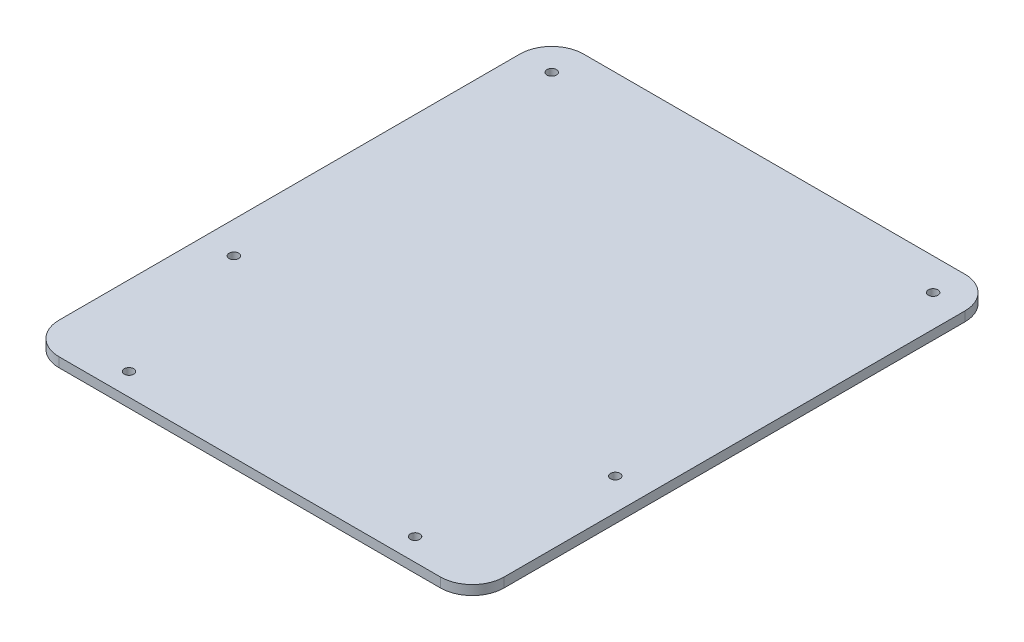
ISO-10303-21;
HEADER;
FILE_DESCRIPTION(('STEP AP214'),'2;1');
FILE_NAME('part.step','',(''),(''),'','','');
FILE_SCHEMA(('AUTOMOTIVE_DESIGN { 1 0 10303 214 1 1 1 1 }'));
ENDSEC;
DATA;
#1=APPLICATION_CONTEXT('core data for automotive mechanical design processes');
#2=APPLICATION_PROTOCOL_DEFINITION('international standard','automotive_design',2000,#1);
#3=PRODUCT_CONTEXT('',#1,'mechanical');
#4=PRODUCT('Part','Part','',(#3));
#5=PRODUCT_RELATED_PRODUCT_CATEGORY('part','',(#4));
#6=PRODUCT_DEFINITION_FORMATION('','',#4);
#7=PRODUCT_DEFINITION_CONTEXT('part definition',#1,'design');
#8=PRODUCT_DEFINITION('design','',#6,#7);
#9=PRODUCT_DEFINITION_SHAPE('','',#8);
#10=(LENGTH_UNIT() NAMED_UNIT(*) SI_UNIT(.MILLI.,.METRE.));
#11=(NAMED_UNIT(*) PLANE_ANGLE_UNIT() SI_UNIT($,.RADIAN.));
#12=(NAMED_UNIT(*) SI_UNIT($,.STERADIAN.) SOLID_ANGLE_UNIT());
#13=UNCERTAINTY_MEASURE_WITH_UNIT(LENGTH_MEASURE(1.E-05),#10,'distance_accuracy_value','');
#14=(GEOMETRIC_REPRESENTATION_CONTEXT(3) GLOBAL_UNCERTAINTY_ASSIGNED_CONTEXT((#13)) GLOBAL_UNIT_ASSIGNED_CONTEXT((#10,
#11,#12)) REPRESENTATION_CONTEXT('',''));
#15=CARTESIAN_POINT('',(0.,0.,0.));
#16=DIRECTION('',(0.,0.,1.));
#17=DIRECTION('',(1.,0.,0.));
#18=AXIS2_PLACEMENT_3D('',#15,#16,#17);
#19=CARTESIAN_POINT('',(70.,3.,0.));
#20=DIRECTION('',(1.,0.,0.));
#21=DIRECTION('',(0.,0.,-1.));
#22=AXIS2_PLACEMENT_3D('',#19,#20,#21);
#23=PLANE('',#22);
#24=DIRECTION('',(0.,0.,1.));
#25=VECTOR('',#24,1.);
#26=CARTESIAN_POINT('',(70.,0.,0.));
#27=LINE('',#26,#25);
#28=CARTESIAN_POINT('',(70.,0.,-50.));
#29=VERTEX_POINT('',#28);
#30=CARTESIAN_POINT('',(70.,0.,95.));
#31=VERTEX_POINT('',#30);
#32=EDGE_CURVE('E111',#29,#31,#27,.T.);
#33=ORIENTED_EDGE('',*,*,#32,.F.);
#34=DIRECTION('',(0.,1.,0.));
#35=VECTOR('',#34,1.);
#36=CARTESIAN_POINT('',(70.,3.,-50.));
#37=LINE('',#36,#35);
#38=CARTESIAN_POINT('',(70.,3.,-50.));
#39=VERTEX_POINT('',#38);
#40=EDGE_CURVE('E172',#29,#39,#37,.T.);
#41=ORIENTED_EDGE('',*,*,#40,.T.);
#42=DIRECTION('',(0.,0.,1.));
#43=VECTOR('',#42,1.);
#44=CARTESIAN_POINT('',(70.,3.,0.));
#45=LINE('',#44,#43);
#46=CARTESIAN_POINT('',(70.,3.,95.));
#47=VERTEX_POINT('',#46);
#48=EDGE_CURVE('E138',#39,#47,#45,.T.);
#49=ORIENTED_EDGE('',*,*,#48,.T.);
#50=DIRECTION('',(0.,-1.,0.));
#51=VECTOR('',#50,1.);
#52=CARTESIAN_POINT('',(70.,0.,95.));
#53=LINE('',#52,#51);
#54=EDGE_CURVE('E131',#47,#31,#53,.T.);
#55=ORIENTED_EDGE('',*,*,#54,.T.);
#56=EDGE_LOOP('',(#33,#41,#49,#55));
#57=FACE_BOUND('',#56,.T.);
#58=ADVANCED_FACE('F45',(#57),#23,.T.);
#59=CARTESIAN_POINT('',(-69.9999999999999,3.,0.));
#60=DIRECTION('',(1.,0.,0.));
#61=DIRECTION('',(0.,0.,-1.));
#62=AXIS2_PLACEMENT_3D('',#59,#60,#61);
#63=PLANE('',#62);
#64=DIRECTION('',(0.,0.,1.));
#65=VECTOR('',#64,1.);
#66=CARTESIAN_POINT('',(-69.9999999999999,3.,0.));
#67=LINE('',#66,#65);
#68=CARTESIAN_POINT('',(-70.,3.,-50.));
#69=VERTEX_POINT('',#68);
#70=CARTESIAN_POINT('',(-69.9999999999998,3.,95.));
#71=VERTEX_POINT('',#70);
#72=EDGE_CURVE('E148',#69,#71,#67,.T.);
#73=ORIENTED_EDGE('',*,*,#72,.F.);
#74=DIRECTION('',(0.,1.,0.));
#75=VECTOR('',#74,1.);
#76=CARTESIAN_POINT('',(-70.,3.,-50.));
#77=LINE('',#76,#75);
#78=CARTESIAN_POINT('',(-70.,0.,-50.));
#79=VERTEX_POINT('',#78);
#80=EDGE_CURVE('E11',#69,#79,#77,.F.);
#81=ORIENTED_EDGE('',*,*,#80,.T.);
#82=DIRECTION('',(0.,0.,1.));
#83=VECTOR('',#82,1.);
#84=CARTESIAN_POINT('',(-69.9999999999999,0.,0.));
#85=LINE('',#84,#83);
#86=CARTESIAN_POINT('',(-69.9999999999998,0.,95.));
#87=VERTEX_POINT('',#86);
#88=EDGE_CURVE('E123',#79,#87,#85,.T.);
#89=ORIENTED_EDGE('',*,*,#88,.T.);
#90=DIRECTION('',(0.,-1.,0.));
#91=VECTOR('',#90,1.);
#92=CARTESIAN_POINT('',(-69.9999999999998,3.,95.));
#93=LINE('',#92,#91);
#94=EDGE_CURVE('E165',#87,#71,#93,.F.);
#95=ORIENTED_EDGE('',*,*,#94,.T.);
#96=EDGE_LOOP('',(#73,#81,#89,#95));
#97=FACE_BOUND('',#96,.T.);
#98=ADVANCED_FACE('F199',(#97),#63,.F.);
#99=CARTESIAN_POINT('',(0.,3.,105.));
#100=DIRECTION('',(0.,0.,-1.));
#101=DIRECTION('',(-1.,0.,0.));
#102=AXIS2_PLACEMENT_3D('',#99,#100,#101);
#103=PLANE('',#102);
#104=DIRECTION('',(1.,0.,0.));
#105=VECTOR('',#104,1.);
#106=CARTESIAN_POINT('',(0.,0.,105.));
#107=LINE('',#106,#105);
#108=CARTESIAN_POINT('',(-59.9999999999998,0.,105.));
#109=VERTEX_POINT('',#108);
#110=CARTESIAN_POINT('',(60.,0.,105.));
#111=VERTEX_POINT('',#110);
#112=EDGE_CURVE('E151',#109,#111,#107,.T.);
#113=ORIENTED_EDGE('',*,*,#112,.T.);
#114=DIRECTION('',(0.,-1.,0.));
#115=VECTOR('',#114,1.);
#116=CARTESIAN_POINT('',(60.,3.,105.));
#117=LINE('',#116,#115);
#118=CARTESIAN_POINT('',(60.,3.,105.));
#119=VERTEX_POINT('',#118);
#120=EDGE_CURVE('E132',#111,#119,#117,.F.);
#121=ORIENTED_EDGE('',*,*,#120,.T.);
#122=DIRECTION('',(1.,0.,0.));
#123=VECTOR('',#122,1.);
#124=CARTESIAN_POINT('',(0.,3.,105.));
#125=LINE('',#124,#123);
#126=CARTESIAN_POINT('',(-59.9999999999998,3.,105.));
#127=VERTEX_POINT('',#126);
#128=EDGE_CURVE('E141',#127,#119,#125,.T.);
#129=ORIENTED_EDGE('',*,*,#128,.F.);
#130=DIRECTION('',(0.,-1.,0.));
#131=VECTOR('',#130,1.);
#132=CARTESIAN_POINT('',(-59.9999999999998,3.,105.));
#133=LINE('',#132,#131);
#134=EDGE_CURVE('E134',#127,#109,#133,.T.);
#135=ORIENTED_EDGE('',*,*,#134,.T.);
#136=EDGE_LOOP('',(#113,#121,#129,#135));
#137=FACE_BOUND('',#136,.T.);
#138=ADVANCED_FACE('F210',(#137),#103,.F.);
#139=CARTESIAN_POINT('',(0.,3.,0.));
#140=DIRECTION('',(0.,1.,0.));
#141=DIRECTION('',(0.,0.,1.));
#142=AXIS2_PLACEMENT_3D('',#139,#140,#141);
#143=PLANE('',#142);
#144=ORIENTED_EDGE('',*,*,#48,.F.);
#145=CARTESIAN_POINT('',(60.,3.,-50.));
#146=DIRECTION('',(0.,1.,0.));
#147=DIRECTION('',(0.,0.,1.));
#148=AXIS2_PLACEMENT_3D('',#145,#146,#147);
#149=CIRCLE('',#148,10.);
#150=CARTESIAN_POINT('',(60.,3.,-60.));
#151=VERTEX_POINT('',#150);
#152=EDGE_CURVE('E178',#39,#151,#149,.T.);
#153=ORIENTED_EDGE('',*,*,#152,.T.);
#154=DIRECTION('',(1.,0.,0.));
#155=VECTOR('',#154,1.);
#156=CARTESIAN_POINT('',(-70.,3.,-60.));
#157=LINE('',#156,#155);
#158=CARTESIAN_POINT('',(-60.,3.,-60.));
#159=VERTEX_POINT('',#158);
#160=EDGE_CURVE('E198',#159,#151,#157,.T.);
#161=ORIENTED_EDGE('',*,*,#160,.F.);
#162=CARTESIAN_POINT('',(-60.,3.,-50.));
#163=DIRECTION('',(0.,1.,0.));
#164=DIRECTION('',(0.,0.,1.));
#165=AXIS2_PLACEMENT_3D('',#162,#163,#164);
#166=CIRCLE('',#165,10.);
#167=EDGE_CURVE('E175',#159,#69,#166,.T.);
#168=ORIENTED_EDGE('',*,*,#167,.T.);
#169=ORIENTED_EDGE('',*,*,#72,.T.);
#170=CARTESIAN_POINT('',(-59.9999999999998,3.,95.));
#171=DIRECTION('',(0.,1.,0.));
#172=DIRECTION('',(0.,0.,1.));
#173=AXIS2_PLACEMENT_3D('',#170,#171,#172);
#174=CIRCLE('',#173,10.);
#175=EDGE_CURVE('E159',#71,#127,#174,.T.);
#176=ORIENTED_EDGE('',*,*,#175,.T.);
#177=ORIENTED_EDGE('',*,*,#128,.T.);
#178=CARTESIAN_POINT('',(60.,3.,95.));
#179=DIRECTION('',(0.,1.,0.));
#180=DIRECTION('',(0.,0.,1.));
#181=AXIS2_PLACEMENT_3D('',#178,#179,#180);
#182=CIRCLE('',#181,10.);
#183=EDGE_CURVE('E162',#119,#47,#182,.T.);
#184=ORIENTED_EDGE('',*,*,#183,.T.);
#185=EDGE_LOOP('',(#144,#153,#161,#168,#169,#176,#177,#184));
#186=FACE_BOUND('',#185,.T.);
#187=CARTESIAN_POINT('',(45.,3.,98.));
#188=DIRECTION('',(0.,1.,0.));
#189=DIRECTION('',(0.,0.,1.));
#190=AXIS2_PLACEMENT_3D('',#187,#188,#189);
#191=CIRCLE('',#190,1.5);
#192=CARTESIAN_POINT('',(45.,3.,99.5));
#193=VERTEX_POINT('',#192);
#194=EDGE_CURVE('E439',#193,#193,#191,.T.);
#195=ORIENTED_EDGE('',*,*,#194,.F.);
#196=EDGE_LOOP('',(#195));
#197=FACE_BOUND('',#196,.T.);
#198=CARTESIAN_POINT('',(60.,3.,-50.));
#199=DIRECTION('',(0.,1.,0.));
#200=DIRECTION('',(0.,0.,-1.));
#201=AXIS2_PLACEMENT_3D('',#198,#199,#200);
#202=CIRCLE('',#201,1.5);
#203=CARTESIAN_POINT('',(60.,3.,-51.5));
#204=VERTEX_POINT('',#203);
#205=EDGE_CURVE('E433',#204,#204,#202,.T.);
#206=ORIENTED_EDGE('',*,*,#205,.F.);
#207=EDGE_LOOP('',(#206));
#208=FACE_BOUND('',#207,.T.);
#209=CARTESIAN_POINT('',(-60.,3.,-50.));
#210=DIRECTION('',(0.,1.,0.));
#211=DIRECTION('',(0.,0.,1.));
#212=AXIS2_PLACEMENT_3D('',#209,#210,#211);
#213=CIRCLE('',#212,1.5);
#214=CARTESIAN_POINT('',(-60.,3.,-48.5));
#215=VERTEX_POINT('',#214);
#216=EDGE_CURVE('E124',#215,#215,#213,.T.);
#217=ORIENTED_EDGE('',*,*,#216,.F.);
#218=EDGE_LOOP('',(#217));
#219=FACE_BOUND('',#218,.T.);
#220=CARTESIAN_POINT('',(-45.,3.,98.));
#221=DIRECTION('',(0.,1.,0.));
#222=DIRECTION('',(0.,0.,-1.));
#223=AXIS2_PLACEMENT_3D('',#220,#221,#222);
#224=CIRCLE('',#223,1.5);
#225=CARTESIAN_POINT('',(-45.,3.,96.5));
#226=VERTEX_POINT('',#225);
#227=EDGE_CURVE('E445',#226,#226,#224,.T.);
#228=ORIENTED_EDGE('',*,*,#227,.F.);
#229=EDGE_LOOP('',(#228));
#230=FACE_BOUND('',#229,.T.);
#231=CARTESIAN_POINT('',(60.,3.,50.));
#232=DIRECTION('',(0.,1.,0.));
#233=DIRECTION('',(0.,0.,1.));
#234=AXIS2_PLACEMENT_3D('',#231,#232,#233);
#235=CIRCLE('',#234,1.5);
#236=CARTESIAN_POINT('',(60.,3.,51.5));
#237=VERTEX_POINT('',#236);
#238=EDGE_CURVE('E454',#237,#237,#235,.T.);
#239=ORIENTED_EDGE('',*,*,#238,.F.);
#240=EDGE_LOOP('',(#239));
#241=FACE_BOUND('',#240,.T.);
#242=CARTESIAN_POINT('',(-60.,3.,50.));
#243=DIRECTION('',(0.,1.,0.));
#244=DIRECTION('',(0.,0.,-1.));
#245=AXIS2_PLACEMENT_3D('',#242,#243,#244);
#246=CIRCLE('',#245,1.5);
#247=CARTESIAN_POINT('',(-60.,3.,48.5));
#248=VERTEX_POINT('',#247);
#249=EDGE_CURVE('E426',#248,#248,#246,.T.);
#250=ORIENTED_EDGE('',*,*,#249,.F.);
#251=EDGE_LOOP('',(#250));
#252=FACE_BOUND('',#251,.T.);
#253=ADVANCED_FACE('F196',(#186,#197,#208,#219,#230,#241,#252),#143,.T.);
#254=CARTESIAN_POINT('',(0.,0.,0.));
#255=DIRECTION('',(0.,1.,0.));
#256=DIRECTION('',(0.,0.,1.));
#257=AXIS2_PLACEMENT_3D('',#254,#255,#256);
#258=PLANE('',#257);
#259=CARTESIAN_POINT('',(45.,0.,98.));
#260=DIRECTION('',(0.,1.,0.));
#261=DIRECTION('',(0.,0.,1.));
#262=AXIS2_PLACEMENT_3D('',#259,#260,#261);
#263=CIRCLE('',#262,1.5);
#264=CARTESIAN_POINT('',(45.,0.,99.5));
#265=VERTEX_POINT('',#264);
#266=EDGE_CURVE('E406',#265,#265,#263,.T.);
#267=ORIENTED_EDGE('',*,*,#266,.T.);
#268=EDGE_LOOP('',(#267));
#269=FACE_BOUND('',#268,.T.);
#270=CARTESIAN_POINT('',(60.,0.,-50.));
#271=DIRECTION('',(0.,1.,0.));
#272=DIRECTION('',(0.,0.,-1.));
#273=AXIS2_PLACEMENT_3D('',#270,#271,#272);
#274=CIRCLE('',#273,1.5);
#275=CARTESIAN_POINT('',(60.,0.,-51.5));
#276=VERTEX_POINT('',#275);
#277=EDGE_CURVE('E410',#276,#276,#274,.T.);
#278=ORIENTED_EDGE('',*,*,#277,.T.);
#279=EDGE_LOOP('',(#278));
#280=FACE_BOUND('',#279,.T.);
#281=CARTESIAN_POINT('',(-60.,0.,-50.));
#282=DIRECTION('',(0.,1.,0.));
#283=DIRECTION('',(0.,0.,1.));
#284=AXIS2_PLACEMENT_3D('',#281,#282,#283);
#285=CIRCLE('',#284,1.5);
#286=CARTESIAN_POINT('',(-60.,0.,-48.5));
#287=VERTEX_POINT('',#286);
#288=EDGE_CURVE('E414',#287,#287,#285,.T.);
#289=ORIENTED_EDGE('',*,*,#288,.T.);
#290=EDGE_LOOP('',(#289));
#291=FACE_BOUND('',#290,.T.);
#292=CARTESIAN_POINT('',(-45.,0.,98.));
#293=DIRECTION('',(0.,1.,0.));
#294=DIRECTION('',(0.,0.,-1.));
#295=AXIS2_PLACEMENT_3D('',#292,#293,#294);
#296=CIRCLE('',#295,1.5);
#297=CARTESIAN_POINT('',(-45.,0.,96.5));
#298=VERTEX_POINT('',#297);
#299=EDGE_CURVE('E418',#298,#298,#296,.T.);
#300=ORIENTED_EDGE('',*,*,#299,.T.);
#301=EDGE_LOOP('',(#300));
#302=FACE_BOUND('',#301,.T.);
#303=CARTESIAN_POINT('',(60.,0.,50.));
#304=DIRECTION('',(0.,1.,0.));
#305=DIRECTION('',(0.,0.,1.));
#306=AXIS2_PLACEMENT_3D('',#303,#304,#305);
#307=CIRCLE('',#306,1.5);
#308=CARTESIAN_POINT('',(60.,0.,51.5));
#309=VERTEX_POINT('',#308);
#310=EDGE_CURVE('E422',#309,#309,#307,.T.);
#311=ORIENTED_EDGE('',*,*,#310,.T.);
#312=EDGE_LOOP('',(#311));
#313=FACE_BOUND('',#312,.T.);
#314=CARTESIAN_POINT('',(-60.,0.,50.));
#315=DIRECTION('',(0.,1.,0.));
#316=DIRECTION('',(0.,0.,-1.));
#317=AXIS2_PLACEMENT_3D('',#314,#315,#316);
#318=CIRCLE('',#317,1.5);
#319=CARTESIAN_POINT('',(-60.,0.,48.5));
#320=VERTEX_POINT('',#319);
#321=EDGE_CURVE('E217',#320,#320,#318,.T.);
#322=ORIENTED_EDGE('',*,*,#321,.T.);
#323=EDGE_LOOP('',(#322));
#324=FACE_BOUND('',#323,.T.);
#325=DIRECTION('',(1.,0.,0.));
#326=VECTOR('',#325,1.);
#327=CARTESIAN_POINT('',(0.,0.,-60.));
#328=LINE('',#327,#326);
#329=CARTESIAN_POINT('',(-60.,0.,-60.));
#330=VERTEX_POINT('',#329);
#331=CARTESIAN_POINT('',(60.,0.,-60.));
#332=VERTEX_POINT('',#331);
#333=EDGE_CURVE('E169',#330,#332,#328,.T.);
#334=ORIENTED_EDGE('',*,*,#333,.T.);
#335=CARTESIAN_POINT('',(60.,0.,-50.));
#336=DIRECTION('',(0.,1.,0.));
#337=DIRECTION('',(0.,0.,1.));
#338=AXIS2_PLACEMENT_3D('',#335,#336,#337);
#339=CIRCLE('',#338,10.);
#340=EDGE_CURVE('E54',#332,#29,#339,.F.);
#341=ORIENTED_EDGE('',*,*,#340,.T.);
#342=ORIENTED_EDGE('',*,*,#32,.T.);
#343=CARTESIAN_POINT('',(60.,0.,95.));
#344=DIRECTION('',(0.,1.,0.));
#345=DIRECTION('',(0.,0.,1.));
#346=AXIS2_PLACEMENT_3D('',#343,#344,#345);
#347=CIRCLE('',#346,10.);
#348=EDGE_CURVE('E115',#31,#111,#347,.F.);
#349=ORIENTED_EDGE('',*,*,#348,.T.);
#350=ORIENTED_EDGE('',*,*,#112,.F.);
#351=CARTESIAN_POINT('',(-59.9999999999998,0.,95.));
#352=DIRECTION('',(0.,1.,0.));
#353=DIRECTION('',(0.,0.,1.));
#354=AXIS2_PLACEMENT_3D('',#351,#352,#353);
#355=CIRCLE('',#354,10.);
#356=EDGE_CURVE('E135',#109,#87,#355,.F.);
#357=ORIENTED_EDGE('',*,*,#356,.T.);
#358=ORIENTED_EDGE('',*,*,#88,.F.);
#359=CARTESIAN_POINT('',(-60.,0.,-50.));
#360=DIRECTION('',(0.,1.,0.));
#361=DIRECTION('',(0.,0.,1.));
#362=AXIS2_PLACEMENT_3D('',#359,#360,#361);
#363=CIRCLE('',#362,10.);
#364=EDGE_CURVE('E187',#79,#330,#363,.F.);
#365=ORIENTED_EDGE('',*,*,#364,.T.);
#366=EDGE_LOOP('',(#334,#341,#342,#349,#350,#357,#358,#365));
#367=FACE_BOUND('',#366,.T.);
#368=ADVANCED_FACE('F113',(#269,#280,#291,#302,#313,#324,#367),#258,.F.);
#369=CARTESIAN_POINT('',(-60.,0.,50.));
#370=DIRECTION('',(0.,1.,0.));
#371=DIRECTION('',(0.,0.,1.));
#372=AXIS2_PLACEMENT_3D('',#369,#370,#371);
#373=CYLINDRICAL_SURFACE('',#372,1.5);
#374=ORIENTED_EDGE('',*,*,#321,.F.);
#375=EDGE_LOOP('',(#374));
#376=FACE_BOUND('',#375,.T.);
#377=ORIENTED_EDGE('',*,*,#249,.T.);
#378=EDGE_LOOP('',(#377));
#379=FACE_BOUND('',#378,.T.);
#380=ADVANCED_FACE('F325',(#376,#379),#373,.F.);
#381=CARTESIAN_POINT('',(60.,0.,50.));
#382=DIRECTION('',(0.,1.,0.));
#383=DIRECTION('',(0.,0.,1.));
#384=AXIS2_PLACEMENT_3D('',#381,#382,#383);
#385=CYLINDRICAL_SURFACE('',#384,1.5);
#386=ORIENTED_EDGE('',*,*,#310,.F.);
#387=EDGE_LOOP('',(#386));
#388=FACE_BOUND('',#387,.T.);
#389=ORIENTED_EDGE('',*,*,#238,.T.);
#390=EDGE_LOOP('',(#389));
#391=FACE_BOUND('',#390,.T.);
#392=ADVANCED_FACE('F315',(#388,#391),#385,.F.);
#393=CARTESIAN_POINT('',(-45.,0.,98.));
#394=DIRECTION('',(0.,1.,0.));
#395=DIRECTION('',(0.,0.,1.));
#396=AXIS2_PLACEMENT_3D('',#393,#394,#395);
#397=CYLINDRICAL_SURFACE('',#396,1.5);
#398=ORIENTED_EDGE('',*,*,#299,.F.);
#399=EDGE_LOOP('',(#398));
#400=FACE_BOUND('',#399,.T.);
#401=ORIENTED_EDGE('',*,*,#227,.T.);
#402=EDGE_LOOP('',(#401));
#403=FACE_BOUND('',#402,.T.);
#404=ADVANCED_FACE('F305',(#400,#403),#397,.F.);
#405=CARTESIAN_POINT('',(-60.,0.,-50.));
#406=DIRECTION('',(0.,1.,0.));
#407=DIRECTION('',(0.,0.,1.));
#408=AXIS2_PLACEMENT_3D('',#405,#406,#407);
#409=CYLINDRICAL_SURFACE('',#408,1.5);
#410=ORIENTED_EDGE('',*,*,#288,.F.);
#411=EDGE_LOOP('',(#410));
#412=FACE_BOUND('',#411,.T.);
#413=ORIENTED_EDGE('',*,*,#216,.T.);
#414=EDGE_LOOP('',(#413));
#415=FACE_BOUND('',#414,.T.);
#416=ADVANCED_FACE('F295',(#412,#415),#409,.F.);
#417=CARTESIAN_POINT('',(60.,0.,-50.));
#418=DIRECTION('',(0.,1.,0.));
#419=DIRECTION('',(0.,0.,1.));
#420=AXIS2_PLACEMENT_3D('',#417,#418,#419);
#421=CYLINDRICAL_SURFACE('',#420,1.5);
#422=ORIENTED_EDGE('',*,*,#277,.F.);
#423=EDGE_LOOP('',(#422));
#424=FACE_BOUND('',#423,.T.);
#425=ORIENTED_EDGE('',*,*,#205,.T.);
#426=EDGE_LOOP('',(#425));
#427=FACE_BOUND('',#426,.T.);
#428=ADVANCED_FACE('F285',(#424,#427),#421,.F.);
#429=CARTESIAN_POINT('',(45.,0.,98.));
#430=DIRECTION('',(0.,1.,0.));
#431=DIRECTION('',(0.,0.,1.));
#432=AXIS2_PLACEMENT_3D('',#429,#430,#431);
#433=CYLINDRICAL_SURFACE('',#432,1.5);
#434=ORIENTED_EDGE('',*,*,#266,.F.);
#435=EDGE_LOOP('',(#434));
#436=FACE_BOUND('',#435,.T.);
#437=ORIENTED_EDGE('',*,*,#194,.T.);
#438=EDGE_LOOP('',(#437));
#439=FACE_BOUND('',#438,.T.);
#440=ADVANCED_FACE('F236',(#436,#439),#433,.F.);
#441=CARTESIAN_POINT('',(60.,3.,95.));
#442=DIRECTION('',(0.,1.,0.));
#443=DIRECTION('',(0.,0.,1.));
#444=AXIS2_PLACEMENT_3D('',#441,#442,#443);
#445=CYLINDRICAL_SURFACE('',#444,10.);
#446=ORIENTED_EDGE('',*,*,#183,.F.);
#447=ORIENTED_EDGE('',*,*,#120,.F.);
#448=ORIENTED_EDGE('',*,*,#348,.F.);
#449=ORIENTED_EDGE('',*,*,#54,.F.);
#450=EDGE_LOOP('',(#446,#447,#448,#449));
#451=FACE_BOUND('',#450,.T.);
#452=ADVANCED_FACE('F130',(#451),#445,.T.);
#453=CARTESIAN_POINT('',(-59.9999999999998,3.,95.));
#454=DIRECTION('',(0.,-1.,0.));
#455=DIRECTION('',(0.,0.,-1.));
#456=AXIS2_PLACEMENT_3D('',#453,#454,#455);
#457=CYLINDRICAL_SURFACE('',#456,10.);
#458=ORIENTED_EDGE('',*,*,#175,.F.);
#459=ORIENTED_EDGE('',*,*,#94,.F.);
#460=ORIENTED_EDGE('',*,*,#356,.F.);
#461=ORIENTED_EDGE('',*,*,#134,.F.);
#462=EDGE_LOOP('',(#458,#459,#460,#461));
#463=FACE_BOUND('',#462,.T.);
#464=ADVANCED_FACE('F214',(#463),#457,.T.);
#465=CARTESIAN_POINT('',(-70.,-7.,-60.));
#466=DIRECTION('',(0.,0.,1.));
#467=DIRECTION('',(1.,0.,0.));
#468=AXIS2_PLACEMENT_3D('',#465,#466,#467);
#469=PLANE('',#468);
#470=ORIENTED_EDGE('',*,*,#160,.T.);
#471=DIRECTION('',(0.,1.,0.));
#472=VECTOR('',#471,1.);
#473=CARTESIAN_POINT('',(60.,0.,-60.));
#474=LINE('',#473,#472);
#475=EDGE_CURVE('E67',#151,#332,#474,.F.);
#476=ORIENTED_EDGE('',*,*,#475,.T.);
#477=ORIENTED_EDGE('',*,*,#333,.F.);
#478=DIRECTION('',(0.,1.,0.));
#479=VECTOR('',#478,1.);
#480=CARTESIAN_POINT('',(-60.,-7.,-60.));
#481=LINE('',#480,#479);
#482=EDGE_CURVE('E181',#330,#159,#481,.T.);
#483=ORIENTED_EDGE('',*,*,#482,.T.);
#484=EDGE_LOOP('',(#470,#476,#477,#483));
#485=FACE_BOUND('',#484,.T.);
#486=ADVANCED_FACE('F193',(#485),#469,.F.);
#487=CARTESIAN_POINT('',(60.,3.,-50.));
#488=DIRECTION('',(0.,-1.,0.));
#489=DIRECTION('',(0.,0.,-1.));
#490=AXIS2_PLACEMENT_3D('',#487,#488,#489);
#491=CYLINDRICAL_SURFACE('',#490,10.);
#492=ORIENTED_EDGE('',*,*,#340,.F.);
#493=ORIENTED_EDGE('',*,*,#475,.F.);
#494=ORIENTED_EDGE('',*,*,#152,.F.);
#495=ORIENTED_EDGE('',*,*,#40,.F.);
#496=EDGE_LOOP('',(#492,#493,#494,#495));
#497=FACE_BOUND('',#496,.T.);
#498=ADVANCED_FACE('F219',(#497),#491,.T.);
#499=CARTESIAN_POINT('',(-60.,-7.,-50.));
#500=DIRECTION('',(0.,1.,0.));
#501=DIRECTION('',(0.,0.,1.));
#502=AXIS2_PLACEMENT_3D('',#499,#500,#501);
#503=CYLINDRICAL_SURFACE('',#502,10.);
#504=ORIENTED_EDGE('',*,*,#364,.F.);
#505=ORIENTED_EDGE('',*,*,#80,.F.);
#506=ORIENTED_EDGE('',*,*,#167,.F.);
#507=ORIENTED_EDGE('',*,*,#482,.F.);
#508=EDGE_LOOP('',(#504,#505,#506,#507));
#509=FACE_BOUND('',#508,.T.);
#510=ADVANCED_FACE('F47',(#509),#503,.T.);
#511=CLOSED_SHELL('',(#58,#98,#138,#253,#368,#380,#392,#404,#416,#428,#440,#452,#464,#486,#498,#510));
#512=MANIFOLD_SOLID_BREP('B2',#511);
#513=ADVANCED_BREP_SHAPE_REPRESENTATION('',(#18,#512),#14);
#514=SHAPE_DEFINITION_REPRESENTATION(#9,#513);
ENDSEC;
END-ISO-10303-21;
